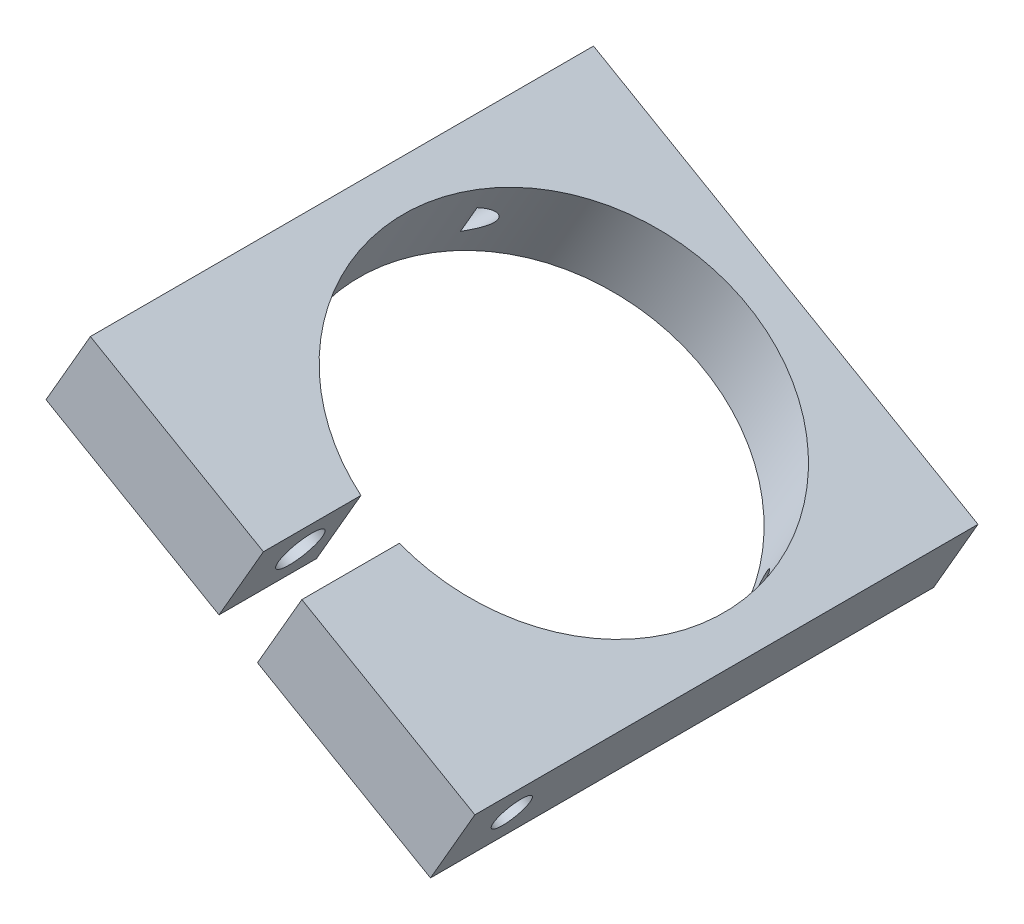
ISO-10303-21;
HEADER;
FILE_DESCRIPTION(('STEP AP214'),'2;1');
FILE_NAME('part.step','',(''),(''),'','','');
FILE_SCHEMA(('AUTOMOTIVE_DESIGN { 1 0 10303 214 1 1 1 1 }'));
ENDSEC;
DATA;
#1=APPLICATION_CONTEXT('core data for automotive mechanical design processes');
#2=APPLICATION_PROTOCOL_DEFINITION('international standard','automotive_design',2000,#1);
#3=PRODUCT_CONTEXT('',#1,'mechanical');
#4=PRODUCT('Part','Part','',(#3));
#5=PRODUCT_RELATED_PRODUCT_CATEGORY('part','',(#4));
#6=PRODUCT_DEFINITION_FORMATION('','',#4);
#7=PRODUCT_DEFINITION_CONTEXT('part definition',#1,'design');
#8=PRODUCT_DEFINITION('design','',#6,#7);
#9=PRODUCT_DEFINITION_SHAPE('','',#8);
#10=(LENGTH_UNIT() NAMED_UNIT(*) SI_UNIT(.MILLI.,.METRE.));
#11=(NAMED_UNIT(*) PLANE_ANGLE_UNIT() SI_UNIT($,.RADIAN.));
#12=(NAMED_UNIT(*) SI_UNIT($,.STERADIAN.) SOLID_ANGLE_UNIT());
#13=UNCERTAINTY_MEASURE_WITH_UNIT(LENGTH_MEASURE(1.E-05),#10,'distance_accuracy_value','');
#14=(GEOMETRIC_REPRESENTATION_CONTEXT(3) GLOBAL_UNCERTAINTY_ASSIGNED_CONTEXT((#13)) GLOBAL_UNIT_ASSIGNED_CONTEXT((#10,
#11,#12)) REPRESENTATION_CONTEXT('',''));
#15=CARTESIAN_POINT('',(0.,0.,0.));
#16=DIRECTION('',(0.,0.,1.));
#17=DIRECTION('',(1.,0.,0.));
#18=AXIS2_PLACEMENT_3D('',#15,#16,#17);
#19=CARTESIAN_POINT('',(127.607695154588,912.355023730723,-391.357743681072));
#20=DIRECTION('',(0.,0.,1.));
#21=DIRECTION('',(1.,0.,0.));
#22=AXIS2_PLACEMENT_3D('',#19,#20,#21);
#23=PLANE('',#22);
#24=DIRECTION('',(0.5,0.866025403784439,0.));
#25=VECTOR('',#24,1.);
#26=CARTESIAN_POINT('',(128.078432583509,912.083243349418,-391.357743681072));
#27=LINE('',#26,#25);
#28=CARTESIAN_POINT('',(128.641247317091,913.058067063231,-391.357743681072));
#29=VERTEX_POINT('',#28);
#30=CARTESIAN_POINT('',(127.515617849926,911.108419635604,-391.357743681072));
#31=VERTEX_POINT('',#30);
#32=EDGE_CURVE('E91',#29,#31,#27,.F.);
#33=ORIENTED_EDGE('',*,*,#32,.T.);
#34=CARTESIAN_POINT('',(127.607695154588,912.355023730723,-391.357743681072));
#35=DIRECTION('',(0.,0.,1.));
#36=DIRECTION('',(1.,0.,0.));
#37=AXIS2_PLACEMENT_3D('',#34,#35,#36);
#38=CIRCLE('',#37,1.25);
#39=EDGE_CURVE('E20',#31,#29,#38,.F.);
#40=ORIENTED_EDGE('',*,*,#39,.T.);
#41=EDGE_LOOP('',(#33,#40));
#42=FACE_BOUND('',#41,.T.);
#43=ADVANCED_FACE('F17',(#42),#23,.F.);
#44=CARTESIAN_POINT('',(147.923440835426,899.577290072852,-391.357743681072));
#45=DIRECTION('',(0.,0.,1.));
#46=DIRECTION('',(1.,0.,0.));
#47=AXIS2_PLACEMENT_3D('',#44,#45,#46);
#48=PLANE('',#47);
#49=CARTESIAN_POINT('',(147.923440835426,899.577290072852,-391.357743681072));
#50=DIRECTION('',(0.,0.,1.));
#51=DIRECTION('',(1.,0.,0.));
#52=AXIS2_PLACEMENT_3D('',#49,#50,#51);
#53=CIRCLE('',#52,1.25);
#54=CARTESIAN_POINT('',(148.034465714591,900.822349700422,-391.357743681072));
#55=VERTEX_POINT('',#54);
#56=CARTESIAN_POINT('',(146.900700008306,898.858609893257,-391.357743681072));
#57=VERTEX_POINT('',#56);
#58=EDGE_CURVE('E100',#55,#57,#53,.F.);
#59=ORIENTED_EDGE('',*,*,#58,.T.);
#60=DIRECTION('',(0.5,0.866025403784439,0.));
#61=VECTOR('',#60,1.);
#62=CARTESIAN_POINT('',(147.921567416493,900.626804112028,-391.357743681072));
#63=LINE('',#62,#61);
#64=EDGE_CURVE('E103',#57,#55,#63,.T.);
#65=ORIENTED_EDGE('',*,*,#64,.T.);
#66=EDGE_LOOP('',(#59,#65));
#67=FACE_BOUND('',#66,.T.);
#68=ADVANCED_FACE('F317',(#67),#48,.F.);
#69=CARTESIAN_POINT('',(130.85529041878,910.480023730723,-371.357743681072));
#70=DIRECTION('',(0.866025403784439,-0.5,0.));
#71=DIRECTION('',(0.5,0.866025403784439,0.));
#72=AXIS2_PLACEMENT_3D('',#69,#70,#71);
#73=CYLINDRICAL_SURFACE('',#72,1.5);
#74=CARTESIAN_POINT('',(136.700961894325,907.105023730723,-371.357743681072));
#75=DIRECTION('',(0.866025403784439,-0.5,0.));
#76=DIRECTION('',(0.5,0.866025403784439,0.));
#77=AXIS2_PLACEMENT_3D('',#74,#75,#76);
#78=CIRCLE('',#77,1.5);
#79=CARTESIAN_POINT('',(137.450961894325,908.4040618364,-371.357743681072));
#80=VERTEX_POINT('',#79);
#81=EDGE_CURVE('E144',#80,#80,#78,.F.);
#82=ORIENTED_EDGE('',*,*,#81,.F.);
#83=EDGE_LOOP('',(#82));
#84=FACE_BOUND('',#83,.T.);
#85=CARTESIAN_POINT('',(125.009618943235,913.855023730723,-371.357743681072));
#86=DIRECTION('',(0.866025403784439,-0.5,0.));
#87=DIRECTION('',(0.5,0.866025403784439,0.));
#88=AXIS2_PLACEMENT_3D('',#85,#86,#87);
#89=CIRCLE('',#88,1.5);
#90=CARTESIAN_POINT('',(125.759618943235,915.1540618364,-371.357743681072));
#91=VERTEX_POINT('',#90);
#92=EDGE_CURVE('E166',#91,#91,#89,.F.);
#93=ORIENTED_EDGE('',*,*,#92,.T.);
#94=EDGE_LOOP('',(#93));
#95=FACE_BOUND('',#94,.T.);
#96=ADVANCED_FACE('F314',(#84,#95),#73,.F.);
#97=CARTESIAN_POINT('',(127.607695154588,912.355023730723,-396.357743681072));
#98=DIRECTION('',(0.,0.,1.));
#99=DIRECTION('',(1.,0.,0.));
#100=AXIS2_PLACEMENT_3D('',#97,#98,#99);
#101=CYLINDRICAL_SURFACE('',#100,1.25);
#102=ORIENTED_EDGE('',*,*,#39,.F.);
#103=CARTESIAN_POINT('',(127.515617849926,911.108419635604,-391.357743681072));
#104=CARTESIAN_POINT('',(127.54807471522,911.106050589834,-391.424874986713));
#105=CARTESIAN_POINT('',(127.581753510776,911.104811756495,-391.491501734669));
#106=CARTESIAN_POINT('',(127.651813067832,911.105301750291,-391.623599616107));
#107=CARTESIAN_POINT('',(127.688202877727,911.107040984337,-391.689065886078));
#108=CARTESIAN_POINT('',(127.764115266057,911.114258744202,-391.81890168151));
#109=CARTESIAN_POINT('',(127.803666827872,911.119776499278,-391.883252367619));
#110=CARTESIAN_POINT('',(127.885614062564,911.135596297288,-392.009411103044));
#111=CARTESIAN_POINT('',(127.928005245685,911.145890933397,-392.07122292807));
#112=CARTESIAN_POINT('',(128.010968981248,911.171156167609,-392.184933084611));
#113=CARTESIAN_POINT('',(128.05124462519,911.185502748532,-392.237181628786));
#114=CARTESIAN_POINT('',(128.13400057092,911.220335195923,-392.337858019734));
#115=CARTESIAN_POINT('',(128.176481354416,911.240822408507,-392.386285025827));
#116=CARTESIAN_POINT('',(128.263855277881,911.289888593677,-392.478254782908));
#117=CARTESIAN_POINT('',(128.30877587796,911.31858995285,-392.521708573745));
#118=CARTESIAN_POINT('',(128.399051897722,911.385807805282,-392.599688219838));
#119=CARTESIAN_POINT('',(128.444404325545,911.424278053507,-392.634254636942));
#120=CARTESIAN_POINT('',(128.51382936587,911.493228533298,-392.678169033972));
#121=CARTESIAN_POINT('',(128.538697014567,911.520074413817,-392.691977271443));
#122=CARTESIAN_POINT('',(128.586854888245,911.577123786808,-392.714349171645));
#123=CARTESIAN_POINT('',(128.610148842541,911.607318858673,-392.722925650125));
#124=CARTESIAN_POINT('',(128.642454599526,911.653528474459,-392.731151203177));
#125=CARTESIAN_POINT('',(128.652438825391,911.668484945408,-392.733121607686));
#126=CARTESIAN_POINT('',(128.671803701858,911.69890011528,-392.735756622392));
#127=CARTESIAN_POINT('',(128.681184218165,911.714358924804,-392.73642094302));
#128=CARTESIAN_POINT('',(128.709184715066,911.762864656355,-392.73641521187));
#129=CARTESIAN_POINT('',(128.726657704516,911.796610981722,-392.733483360501));
#130=CARTESIAN_POINT('',(128.758161244347,911.864773677753,-392.722004282596));
#131=CARTESIAN_POINT('',(128.772185602231,911.899191135681,-392.713447054638));
#132=CARTESIAN_POINT('',(128.796633060627,911.967425812386,-392.691472107619));
#133=CARTESIAN_POINT('',(128.807080454743,912.001245538302,-392.678088497932));
#134=CARTESIAN_POINT('',(128.824744354126,912.067830543306,-392.64728285928));
#135=CARTESIAN_POINT('',(128.831960535929,912.100595716522,-392.629860426269));
#136=CARTESIAN_POINT('',(128.847393961868,912.185955414199,-392.579118213455));
#137=CARTESIAN_POINT('',(128.853100921507,912.237288788129,-392.542918519008));
#138=CARTESIAN_POINT('',(128.858511559909,912.335372551267,-392.464363314685));
#139=CARTESIAN_POINT('',(128.858196807211,912.3821084294,-392.421989299126));
#140=CARTESIAN_POINT('',(128.853452887133,912.46479446094,-392.339275940134));
#141=CARTESIAN_POINT('',(128.84960665655,912.501338180819,-392.299484027972));
#142=CARTESIAN_POINT('',(128.839346546395,912.571320102624,-392.217547113975));
#143=CARTESIAN_POINT('',(128.83293063112,912.604755816452,-392.175400269395));
#144=CARTESIAN_POINT('',(128.810684890219,912.700973792304,-392.046047910079));
#145=CARTESIAN_POINT('',(128.791876600757,912.759453640975,-391.956153765721));
#146=CARTESIAN_POINT('',(128.751847796501,912.86103509998,-391.782004780797));
#147=CARTESIAN_POINT('',(128.731106627847,912.905115215574,-391.698188242048));
#148=CARTESIAN_POINT('',(128.698356557038,912.966154015777,-391.571117453221));
#149=CARTESIAN_POINT('',(128.687236855241,912.985553982897,-391.528788775997));
#150=CARTESIAN_POINT('',(128.664549041072,913.022882440661,-391.443628570795));
#151=CARTESIAN_POINT('',(128.652981128489,913.040811576061,-391.400797272661));
#152=CARTESIAN_POINT('',(128.641247317092,913.058067063231,-391.357743681072));
#153=B_SPLINE_CURVE_WITH_KNOTS('',3,(#103,#104,#105,#106,#107,#108,#109,#110,#111,#112,#113,
#114,#115,#116,#117,#118,#119,#120,#121,#122,#123,#124,#125,#126,#127,#128,#129,#130,#131,#132,
#133,#134,#135,#136,#137,#138,#139,#140,#141,#142,#143,#144,#145,#146,#147,#148,#149,#150,#151,
#152),.UNSPECIFIED.,.F.,.F.,(4,2,2,2,2,2,2,2,2,2,2,2,2,2,2,2,2,2,2,2,2,2,2,2,4),(0.,
0.223852835244016,0.448489525676511,0.675494513857129,0.902148688066406,1.10435915089795,
1.30661397366406,1.51205494754366,1.71654094560003,1.83345002557257,1.95007156215788,
2.00428725628244,2.05851496910174,2.17220219210489,2.28609208955794,2.3991923820805,
2.51230399409453,2.70043472715132,2.889141389009,3.05139545995606,3.21377832364974,
3.53946222025231,3.8300001333799,3.97359127374229,4.11711912909585),.UNSPECIFIED.);
#154=EDGE_CURVE('E98',#31,#29,#153,.T.);
#155=ORIENTED_EDGE('',*,*,#154,.T.);
#156=EDGE_LOOP('',(#102,#155));
#157=FACE_BOUND('',#156,.T.);
#158=CARTESIAN_POINT('',(127.607695154588,912.355023730723,-401.357743681072));
#159=DIRECTION('',(0.,0.,1.));
#160=DIRECTION('',(1.,0.,0.));
#161=AXIS2_PLACEMENT_3D('',#158,#159,#160);
#162=CIRCLE('',#161,1.25);
#163=CARTESIAN_POINT('',(128.857695154588,912.355023730723,-401.357743681072));
#164=VERTEX_POINT('',#163);
#165=EDGE_CURVE('E131',#164,#164,#162,.F.);
#166=ORIENTED_EDGE('',*,*,#165,.T.);
#167=EDGE_LOOP('',(#166));
#168=FACE_BOUND('',#167,.T.);
#169=ADVANCED_FACE('F96',(#157,#168),#101,.F.);
#170=CARTESIAN_POINT('',(147.923440835426,899.577290072852,-396.357743681072));
#171=DIRECTION('',(0.,0.,1.));
#172=DIRECTION('',(1.,0.,0.));
#173=AXIS2_PLACEMENT_3D('',#170,#171,#172);
#174=CYLINDRICAL_SURFACE('',#173,1.25);
#175=ORIENTED_EDGE('',*,*,#58,.F.);
#176=CARTESIAN_POINT('',(148.034465714591,900.822349700422,-391.357743681072));
#177=CARTESIAN_POINT('',(148.001685335158,900.82524384968,-391.426118824964));
#178=CARTESIAN_POINT('',(147.967649258731,900.827000381739,-391.493987142952));
#179=CARTESIAN_POINT('',(147.896799470938,900.827518074483,-391.628565866878));
#180=CARTESIAN_POINT('',(147.859976451299,900.826268725714,-391.69527138649));
#181=CARTESIAN_POINT('',(147.783116358518,900.819991611245,-391.827580703307));
#182=CARTESIAN_POINT('',(147.743049836009,900.814924675961,-391.89316582164));
#183=CARTESIAN_POINT('',(147.659982687579,900.799939584957,-392.021779187282));
#184=CARTESIAN_POINT('',(147.61698669578,900.79002894489,-392.084811232478));
#185=CARTESIAN_POINT('',(147.532952989021,900.765446584561,-392.200578846786));
#186=CARTESIAN_POINT('',(147.49223234493,900.751429741596,-392.253678407756));
#187=CARTESIAN_POINT('',(147.408518552955,900.717202382865,-392.356068406961));
#188=CARTESIAN_POINT('',(147.36552482198,900.69699027145,-392.405357859767));
#189=CARTESIAN_POINT('',(147.277046241013,900.648397228245,-392.499070386439));
#190=CARTESIAN_POINT('',(147.231532954771,900.619893533898,-392.543405339136));
#191=CARTESIAN_POINT('',(147.139984278573,900.552928445523,-392.623148278189));
#192=CARTESIAN_POINT('',(147.093952309647,900.514514069881,-392.658596898558));
#193=CARTESIAN_POINT('',(147.023519411676,900.445576908907,-392.70377457134));
#194=CARTESIAN_POINT('',(146.998345402925,900.418787279048,-392.718004066658));
#195=CARTESIAN_POINT('',(146.94954420597,900.361778475027,-392.741225264732));
#196=CARTESIAN_POINT('',(146.925913469435,900.331567638598,-392.750229387233));
#197=CARTESIAN_POINT('',(146.89241757189,900.284299293164,-392.759248121986));
#198=CARTESIAN_POINT('',(146.881623287104,900.268297105439,-392.761506200025));
#199=CARTESIAN_POINT('',(146.860725552224,900.235705717238,-392.764526474794));
#200=CARTESIAN_POINT('',(146.850622256625,900.219116386736,-392.765288338038));
#201=CARTESIAN_POINT('',(146.821872232837,900.169312190052,-392.765282456633));
#202=CARTESIAN_POINT('',(146.804333914886,900.135424005329,-392.762344456206));
#203=CARTESIAN_POINT('',(146.772726650654,900.066969182398,-392.750840965679));
#204=CARTESIAN_POINT('',(146.758663587022,900.032401499296,-392.742266022355));
#205=CARTESIAN_POINT('',(146.734163565083,899.963859921335,-392.72024282091));
#206=CARTESIAN_POINT('',(146.723702348838,899.92988357828,-392.706828462187));
#207=CARTESIAN_POINT('',(146.706034367449,899.862983548184,-392.675948220419));
#208=CARTESIAN_POINT('',(146.698828013284,899.830059994562,-392.65848182616));
#209=CARTESIAN_POINT('',(146.683463923184,899.744361690732,-392.607653095012));
#210=CARTESIAN_POINT('',(146.677824058121,899.692845120789,-392.571413403411));
#211=CARTESIAN_POINT('',(146.672580271348,899.594403649249,-392.492766690766));
#212=CARTESIAN_POINT('',(146.672994662646,899.547493111017,-392.450341342548));
#213=CARTESIAN_POINT('',(146.67794382546,899.464576325572,-392.367601976533));
#214=CARTESIAN_POINT('',(146.681885187597,899.42796755008,-392.327843519814));
#215=CARTESIAN_POINT('',(146.692342451637,899.357855171758,-392.245973863277));
#216=CARTESIAN_POINT('',(146.698860381163,899.32435404018,-392.203860832995));
#217=CARTESIAN_POINT('',(146.721425926847,899.227933868228,-392.074595294413));
#218=CARTESIAN_POINT('',(146.740464148732,899.169323487853,-391.98475164175));
#219=CARTESIAN_POINT('',(146.782016964543,899.064835340716,-391.806105751061));
#220=CARTESIAN_POINT('',(146.804264955735,899.018415280526,-391.717546878827));
#221=CARTESIAN_POINT('',(146.839415646757,898.954418743631,-391.583249074795));
#222=CARTESIAN_POINT('',(146.851349367753,898.93413456128,-391.538522521981));
#223=CARTESIAN_POINT('',(146.875697452854,898.895190812749,-391.448525373925));
#224=CARTESIAN_POINT('',(146.888111558155,898.87653038891,-391.403255080442));
#225=CARTESIAN_POINT('',(146.900700008306,898.858609893257,-391.357743681072));
#226=B_SPLINE_CURVE_WITH_KNOTS('',3,(#176,#177,#178,#179,#180,#181,#182,#183,#184,#185,#186,
#187,#188,#189,#190,#191,#192,#193,#194,#195,#196,#197,#198,#199,#200,#201,#202,#203,#204,#205,
#206,#207,#208,#209,#210,#211,#212,#213,#214,#215,#216,#217,#218,#219,#220,#221,#222,#223,#224,
#225),.UNSPECIFIED.,.F.,.F.,(4,2,2,2,2,2,2,2,2,2,2,2,2,2,2,2,2,2,2,2,2,2,2,2,4),(0.,
0.22768946313699,0.456176152549731,0.687039662433701,0.917546088669269,1.12232442490655,
1.32715554809245,1.53518877012598,1.74225262794169,1.86008396629252,1.97763408205672,
2.03586724255426,2.09411338088815,2.20826995355054,2.3226184582809,2.43618104480916,
2.54975796643966,2.73838441851071,2.92758154860634,3.08991448972487,3.25237543350151,
3.57826663381483,3.88520294132719,4.03679663083218,4.18830975723314),.UNSPECIFIED.);
#227=EDGE_CURVE('E150',#55,#57,#226,.T.);
#228=ORIENTED_EDGE('',*,*,#227,.T.);
#229=EDGE_LOOP('',(#175,#228));
#230=FACE_BOUND('',#229,.T.);
#231=CARTESIAN_POINT('',(147.923440835426,899.577290072852,-401.357743681072));
#232=DIRECTION('',(0.,0.,1.));
#233=DIRECTION('',(1.,0.,0.));
#234=AXIS2_PLACEMENT_3D('',#231,#232,#233);
#235=CIRCLE('',#234,1.25);
#236=CARTESIAN_POINT('',(149.173440835426,899.577290072852,-401.357743681072));
#237=VERTEX_POINT('',#236);
#238=EDGE_CURVE('E161',#237,#237,#235,.F.);
#239=ORIENTED_EDGE('',*,*,#238,.T.);
#240=EDGE_LOOP('',(#239));
#241=FACE_BOUND('',#240,.T.);
#242=ADVANCED_FACE('F183',(#230,#241),#174,.F.);
#243=CARTESIAN_POINT('',(149.490381056768,896.25694751937,-367.357743681072));
#244=DIRECTION('',(-0.500000000000002,-0.866025403784438,0.));
#245=DIRECTION('',(0.866025403784438,-0.500000000000002,0.));
#246=AXIS2_PLACEMENT_3D('',#243,#244,#245);
#247=PLANE('',#246);
#248=DIRECTION('',(0.,0.,1.));
#249=VECTOR('',#248,1.);
#250=CARTESIAN_POINT('',(149.490381056768,896.25694751937,-367.357743681072));
#251=LINE('',#250,#249);
#252=CARTESIAN_POINT('',(149.490381056768,896.25694751937,-401.357743681072));
#253=VERTEX_POINT('',#252);
#254=CARTESIAN_POINT('',(149.490381056768,896.25694751937,-367.357743681072));
#255=VERTEX_POINT('',#254);
#256=EDGE_CURVE('E123',#253,#255,#251,.T.);
#257=ORIENTED_EDGE('',*,*,#256,.T.);
#258=DIRECTION('',(-0.866025403784439,0.499999999999999,0.));
#259=VECTOR('',#258,1.);
#260=CARTESIAN_POINT('',(149.490381056768,896.25694751937,-367.357743681072));
#261=LINE('',#260,#259);
#262=CARTESIAN_POINT('',(137.799038105678,903.00694751937,-367.357743681072));
#263=VERTEX_POINT('',#262);
#264=EDGE_CURVE('E118',#255,#263,#261,.T.);
#265=ORIENTED_EDGE('',*,*,#264,.T.);
#266=DIRECTION('',(0.,0.,1.));
#267=VECTOR('',#266,1.);
#268=CARTESIAN_POINT('',(137.799038105678,903.00694751937,-369.857743681072));
#269=LINE('',#268,#267);
#270=CARTESIAN_POINT('',(137.799038105678,903.00694751937,-373.948070035081));
#271=VERTEX_POINT('',#270);
#272=EDGE_CURVE('E112',#271,#263,#269,.T.);
#273=ORIENTED_EDGE('',*,*,#272,.F.);
#274=CARTESIAN_POINT('',(136.500000000001,903.75694751937,-386.357743681072));
#275=DIRECTION('',(0.5,0.866025403784439,0.));
#276=DIRECTION('',(-0.866025403784439,0.5,0.));
#277=AXIS2_PLACEMENT_3D('',#274,#275,#276);
#278=CIRCLE('',#277,12.5);
#279=CARTESIAN_POINT('',(135.200961894325,904.50694751937,-373.948070035081));
#280=VERTEX_POINT('',#279);
#281=EDGE_CURVE('E105',#271,#280,#278,.T.);
#282=ORIENTED_EDGE('',*,*,#281,.T.);
#283=DIRECTION('',(0.,0.,1.));
#284=VECTOR('',#283,1.);
#285=CARTESIAN_POINT('',(135.200961894325,904.50694751937,-369.857743681072));
#286=LINE('',#285,#284);
#287=CARTESIAN_POINT('',(135.200961894325,904.50694751937,-367.357743681072));
#288=VERTEX_POINT('',#287);
#289=EDGE_CURVE('E147',#288,#280,#286,.F.);
#290=ORIENTED_EDGE('',*,*,#289,.F.);
#291=DIRECTION('',(-0.866025403784438,0.5,0.));
#292=VECTOR('',#291,1.);
#293=CARTESIAN_POINT('',(135.200961894325,904.50694751937,-367.357743681072));
#294=LINE('',#293,#292);
#295=CARTESIAN_POINT('',(123.509618943235,911.25694751937,-367.357743681072));
#296=VERTEX_POINT('',#295);
#297=EDGE_CURVE('E141',#288,#296,#294,.T.);
#298=ORIENTED_EDGE('',*,*,#297,.T.);
#299=DIRECTION('',(0.,0.,1.));
#300=VECTOR('',#299,1.);
#301=CARTESIAN_POINT('',(123.509618943235,911.25694751937,-367.357743681072));
#302=LINE('',#301,#300);
#303=CARTESIAN_POINT('',(123.509618943235,911.25694751937,-401.357743681072));
#304=VERTEX_POINT('',#303);
#305=EDGE_CURVE('E135',#296,#304,#302,.F.);
#306=ORIENTED_EDGE('',*,*,#305,.T.);
#307=DIRECTION('',(0.866025403784437,-0.500000000000003,0.));
#308=VECTOR('',#307,1.);
#309=CARTESIAN_POINT('',(123.509618943235,911.25694751937,-401.357743681072));
#310=LINE('',#309,#308);
#311=EDGE_CURVE('E129',#304,#253,#310,.T.);
#312=ORIENTED_EDGE('',*,*,#311,.T.);
#313=EDGE_LOOP('',(#257,#265,#273,#282,#290,#298,#306,#312));
#314=FACE_BOUND('',#313,.T.);
#315=ADVANCED_FACE('F196',(#314),#247,.T.);
#316=CARTESIAN_POINT('',(138.000000000001,906.355023730723,-371.357743681072));
#317=DIRECTION('',(-0.866025403784439,0.5,0.));
#318=DIRECTION('',(-0.5,-0.866025403784439,0.));
#319=AXIS2_PLACEMENT_3D('',#316,#317,#318);
#320=CYLINDRICAL_SURFACE('',#319,1.25);
#321=CARTESIAN_POINT('',(139.299038105678,905.605023730723,-371.357743681072));
#322=DIRECTION('',(-0.866025403784439,0.5,0.));
#323=DIRECTION('',(-0.5,-0.866025403784439,0.));
#324=AXIS2_PLACEMENT_3D('',#321,#322,#323);
#325=CIRCLE('',#324,1.25);
#326=CARTESIAN_POINT('',(138.674038105678,904.522491975992,-371.357743681072));
#327=VERTEX_POINT('',#326);
#328=EDGE_CURVE('E114',#327,#327,#325,.F.);
#329=ORIENTED_EDGE('',*,*,#328,.F.);
#330=EDGE_LOOP('',(#329));
#331=FACE_BOUND('',#330,.T.);
#332=CARTESIAN_POINT('',(150.990381056768,898.855023730723,-371.357743681072));
#333=DIRECTION('',(-0.866025403784439,0.5,0.));
#334=DIRECTION('',(-0.5,-0.866025403784439,0.));
#335=AXIS2_PLACEMENT_3D('',#332,#333,#334);
#336=CIRCLE('',#335,1.25);
#337=CARTESIAN_POINT('',(150.365381056768,897.772491975992,-371.357743681072));
#338=VERTEX_POINT('',#337);
#339=EDGE_CURVE('E125',#338,#338,#336,.F.);
#340=ORIENTED_EDGE('',*,*,#339,.T.);
#341=EDGE_LOOP('',(#340));
#342=FACE_BOUND('',#341,.T.);
#343=ADVANCED_FACE('F191',(#331,#342),#320,.F.);
#344=CARTESIAN_POINT('',(138.000000000001,906.355023730723,-386.357743681072));
#345=DIRECTION('',(0.5,0.866025403784439,0.));
#346=DIRECTION('',(-0.866025403784439,0.5,0.));
#347=AXIS2_PLACEMENT_3D('',#344,#345,#346);
#348=CYLINDRICAL_SURFACE('',#347,12.5);
#349=ORIENTED_EDGE('',*,*,#227,.F.);
#350=ORIENTED_EDGE('',*,*,#64,.F.);
#351=EDGE_LOOP('',(#349,#350));
#352=FACE_BOUND('',#351,.T.);
#353=ORIENTED_EDGE('',*,*,#154,.F.);
#354=ORIENTED_EDGE('',*,*,#32,.F.);
#355=EDGE_LOOP('',(#353,#354));
#356=FACE_BOUND('',#355,.T.);
#357=CARTESIAN_POINT('',(139.500000000001,908.953099942076,-386.357743681072));
#358=DIRECTION('',(0.5,0.866025403784439,0.));
#359=DIRECTION('',(-0.866025403784439,0.5,0.));
#360=AXIS2_PLACEMENT_3D('',#357,#358,#359);
#361=CIRCLE('',#360,12.5);
#362=CARTESIAN_POINT('',(140.799038105678,908.203099942077,-373.948070035081));
#363=VERTEX_POINT('',#362);
#364=CARTESIAN_POINT('',(138.200961894325,909.703099942076,-373.948070035081));
#365=VERTEX_POINT('',#364);
#366=EDGE_CURVE('E153',#363,#365,#361,.T.);
#367=ORIENTED_EDGE('',*,*,#366,.T.);
#368=DIRECTION('',(0.5,0.866025403784439,0.));
#369=VECTOR('',#368,1.);
#370=CARTESIAN_POINT('',(136.700961894325,907.105023730723,-373.948070035081));
#371=LINE('',#370,#369);
#372=EDGE_CURVE('E149',#280,#365,#371,.T.);
#373=ORIENTED_EDGE('',*,*,#372,.F.);
#374=ORIENTED_EDGE('',*,*,#281,.F.);
#375=DIRECTION('',(-0.5,-0.866025403784439,0.));
#376=VECTOR('',#375,1.);
#377=CARTESIAN_POINT('',(139.299038105678,905.605023730723,-373.948070035081));
#378=LINE('',#377,#376);
#379=EDGE_CURVE('E115',#363,#271,#378,.T.);
#380=ORIENTED_EDGE('',*,*,#379,.F.);
#381=EDGE_LOOP('',(#367,#373,#374,#380));
#382=FACE_BOUND('',#381,.T.);
#383=ADVANCED_FACE('F101',(#352,#356,#382),#348,.F.);
#384=CARTESIAN_POINT('',(136.700961894325,907.105023730723,-369.857743681072));
#385=DIRECTION('',(0.866025403784439,-0.5,0.));
#386=DIRECTION('',(0.5,0.866025403784439,0.));
#387=AXIS2_PLACEMENT_3D('',#384,#385,#386);
#388=PLANE('',#387);
#389=ORIENTED_EDGE('',*,*,#81,.T.);
#390=EDGE_LOOP('',(#389));
#391=FACE_BOUND('',#390,.T.);
#392=ORIENTED_EDGE('',*,*,#372,.T.);
#393=DIRECTION('',(0.,0.,1.));
#394=VECTOR('',#393,1.);
#395=CARTESIAN_POINT('',(138.200961894325,909.703099942077,-367.357743681072));
#396=LINE('',#395,#394);
#397=CARTESIAN_POINT('',(138.200961894325,909.703099942077,-367.357743681072));
#398=VERTEX_POINT('',#397);
#399=EDGE_CURVE('E156',#365,#398,#396,.T.);
#400=ORIENTED_EDGE('',*,*,#399,.T.);
#401=DIRECTION('',(-0.500000000000039,-0.866025403784416,0.));
#402=VECTOR('',#401,1.);
#403=CARTESIAN_POINT('',(138.200961894325,909.703099942076,-367.357743681072));
#404=LINE('',#403,#402);
#405=EDGE_CURVE('E138',#398,#288,#404,.T.);
#406=ORIENTED_EDGE('',*,*,#405,.T.);
#407=ORIENTED_EDGE('',*,*,#289,.T.);
#408=EDGE_LOOP('',(#392,#400,#406,#407));
#409=FACE_BOUND('',#408,.T.);
#410=ADVANCED_FACE('F190',(#391,#409),#388,.T.);
#411=CARTESIAN_POINT('',(118.336783205462,907.493485625047,-367.357743681072));
#412=DIRECTION('',(0.,0.,-1.));
#413=DIRECTION('',(-1.,0.,0.));
#414=AXIS2_PLACEMENT_3D('',#411,#412,#413);
#415=PLANE('',#414);
#416=DIRECTION('',(0.866025403784439,-0.499999999999999,0.));
#417=VECTOR('',#416,1.);
#418=CARTESIAN_POINT('',(152.490381056768,901.453099942077,-367.357743681072));
#419=LINE('',#418,#417);
#420=CARTESIAN_POINT('',(126.509618943235,916.453099942077,-367.357743681072));
#421=VERTEX_POINT('',#420);
#422=EDGE_CURVE('E242',#398,#421,#419,.F.);
#423=ORIENTED_EDGE('',*,*,#422,.T.);
#424=DIRECTION('',(0.499999999999996,0.866025403784441,0.));
#425=VECTOR('',#424,1.);
#426=CARTESIAN_POINT('',(126.509618943235,916.453099942077,-367.357743681072));
#427=LINE('',#426,#425);
#428=EDGE_CURVE('E137',#421,#296,#427,.F.);
#429=ORIENTED_EDGE('',*,*,#428,.T.);
#430=ORIENTED_EDGE('',*,*,#297,.F.);
#431=ORIENTED_EDGE('',*,*,#405,.F.);
#432=EDGE_LOOP('',(#423,#429,#430,#431));
#433=FACE_BOUND('',#432,.T.);
#434=ADVANCED_FACE('F231',(#433),#415,.F.);
#435=CARTESIAN_POINT('',(126.509618943235,916.453099942077,-367.357743681072));
#436=DIRECTION('',(0.866025403784441,-0.499999999999996,0.));
#437=DIRECTION('',(0.499999999999996,0.866025403784441,0.));
#438=AXIS2_PLACEMENT_3D('',#435,#436,#437);
#439=PLANE('',#438);
#440=ORIENTED_EDGE('',*,*,#92,.F.);
#441=EDGE_LOOP('',(#440));
#442=FACE_BOUND('',#441,.T.);
#443=DIRECTION('',(0.,0.,1.));
#444=VECTOR('',#443,1.);
#445=CARTESIAN_POINT('',(126.509618943235,916.453099942077,-367.357743681072));
#446=LINE('',#445,#444);
#447=CARTESIAN_POINT('',(126.509618943235,916.453099942077,-401.357743681072));
#448=VERTEX_POINT('',#447);
#449=EDGE_CURVE('E247',#421,#448,#446,.F.);
#450=ORIENTED_EDGE('',*,*,#449,.T.);
#451=DIRECTION('',(-0.499999999999975,-0.866025403784453,0.));
#452=VECTOR('',#451,1.);
#453=CARTESIAN_POINT('',(126.509618943235,916.453099942077,-401.357743681072));
#454=LINE('',#453,#452);
#455=EDGE_CURVE('E132',#448,#304,#454,.T.);
#456=ORIENTED_EDGE('',*,*,#455,.T.);
#457=ORIENTED_EDGE('',*,*,#305,.F.);
#458=ORIENTED_EDGE('',*,*,#428,.F.);
#459=EDGE_LOOP('',(#450,#456,#457,#458));
#460=FACE_BOUND('',#459,.T.);
#461=ADVANCED_FACE('F228',(#442,#460),#439,.F.);
#462=CARTESIAN_POINT('',(130.754809471618,929.002138047753,-401.357743681072));
#463=DIRECTION('',(0.,0.,1.));
#464=DIRECTION('',(1.,0.,0.));
#465=AXIS2_PLACEMENT_3D('',#462,#463,#464);
#466=PLANE('',#465);
#467=ORIENTED_EDGE('',*,*,#238,.F.);
#468=EDGE_LOOP('',(#467));
#469=FACE_BOUND('',#468,.T.);
#470=ORIENTED_EDGE('',*,*,#165,.F.);
#471=EDGE_LOOP('',(#470));
#472=FACE_BOUND('',#471,.T.);
#473=ORIENTED_EDGE('',*,*,#311,.F.);
#474=ORIENTED_EDGE('',*,*,#455,.F.);
#475=DIRECTION('',(0.866025403784439,-0.499999999999999,0.));
#476=VECTOR('',#475,1.);
#477=CARTESIAN_POINT('',(152.490381056768,901.453099942077,-401.357743681072));
#478=LINE('',#477,#476);
#479=CARTESIAN_POINT('',(152.490381056768,901.453099942077,-401.357743681072));
#480=VERTEX_POINT('',#479);
#481=EDGE_CURVE('E250',#448,#480,#478,.T.);
#482=ORIENTED_EDGE('',*,*,#481,.T.);
#483=DIRECTION('',(-0.499999999999998,-0.86602540378444,0.));
#484=VECTOR('',#483,1.);
#485=CARTESIAN_POINT('',(149.490381056768,896.25694751937,-401.357743681072));
#486=LINE('',#485,#484);
#487=EDGE_CURVE('E126',#480,#253,#486,.T.);
#488=ORIENTED_EDGE('',*,*,#487,.T.);
#489=EDGE_LOOP('',(#473,#474,#482,#488));
#490=FACE_BOUND('',#489,.T.);
#491=ADVANCED_FACE('F224',(#469,#472,#490),#466,.F.);
#492=CARTESIAN_POINT('',(149.490381056768,896.25694751937,-367.357743681072));
#493=DIRECTION('',(-0.86602540378444,0.499999999999998,0.));
#494=DIRECTION('',(-0.499999999999998,-0.86602540378444,0.));
#495=AXIS2_PLACEMENT_3D('',#492,#493,#494);
#496=PLANE('',#495);
#497=ORIENTED_EDGE('',*,*,#339,.F.);
#498=EDGE_LOOP('',(#497));
#499=FACE_BOUND('',#498,.T.);
#500=ORIENTED_EDGE('',*,*,#256,.F.);
#501=ORIENTED_EDGE('',*,*,#487,.F.);
#502=DIRECTION('',(0.,0.,1.));
#503=VECTOR('',#502,1.);
#504=CARTESIAN_POINT('',(152.490381056768,901.453099942077,-367.357743681072));
#505=LINE('',#504,#503);
#506=CARTESIAN_POINT('',(152.490381056768,901.453099942077,-367.357743681072));
#507=VERTEX_POINT('',#506);
#508=EDGE_CURVE('E273',#480,#507,#505,.T.);
#509=ORIENTED_EDGE('',*,*,#508,.T.);
#510=DIRECTION('',(-0.499999999999975,-0.866025403784453,0.));
#511=VECTOR('',#510,1.);
#512=CARTESIAN_POINT('',(152.490381056768,901.453099942077,-367.357743681072));
#513=LINE('',#512,#511);
#514=EDGE_CURVE('E120',#507,#255,#513,.T.);
#515=ORIENTED_EDGE('',*,*,#514,.T.);
#516=EDGE_LOOP('',(#500,#501,#509,#515));
#517=FACE_BOUND('',#516,.T.);
#518=ADVANCED_FACE('F220',(#499,#517),#496,.F.);
#519=CARTESIAN_POINT('',(132.626202367905,899.243485625046,-367.357743681072));
#520=DIRECTION('',(0.,0.,-1.));
#521=DIRECTION('',(-1.,0.,0.));
#522=AXIS2_PLACEMENT_3D('',#519,#520,#521);
#523=PLANE('',#522);
#524=ORIENTED_EDGE('',*,*,#264,.F.);
#525=ORIENTED_EDGE('',*,*,#514,.F.);
#526=DIRECTION('',(0.866025403784439,-0.499999999999999,0.));
#527=VECTOR('',#526,1.);
#528=CARTESIAN_POINT('',(152.490381056768,901.453099942077,-367.357743681072));
#529=LINE('',#528,#527);
#530=CARTESIAN_POINT('',(140.799038105678,908.203099942077,-367.357743681072));
#531=VERTEX_POINT('',#530);
#532=EDGE_CURVE('E26',#507,#531,#529,.F.);
#533=ORIENTED_EDGE('',*,*,#532,.T.);
#534=DIRECTION('',(-0.5,-0.866025403784439,0.));
#535=VECTOR('',#534,1.);
#536=CARTESIAN_POINT('',(139.299038105678,905.605023730723,-367.357743681072));
#537=LINE('',#536,#535);
#538=EDGE_CURVE('E34',#263,#531,#537,.F.);
#539=ORIENTED_EDGE('',*,*,#538,.F.);
#540=EDGE_LOOP('',(#524,#525,#533,#539));
#541=FACE_BOUND('',#540,.T.);
#542=ADVANCED_FACE('F213',(#541),#523,.F.);
#543=CARTESIAN_POINT('',(139.299038105678,905.605023730723,-369.857743681072));
#544=DIRECTION('',(-0.866025403784439,0.5,0.));
#545=DIRECTION('',(-0.5,-0.866025403784439,0.));
#546=AXIS2_PLACEMENT_3D('',#543,#544,#545);
#547=PLANE('',#546);
#548=ORIENTED_EDGE('',*,*,#328,.T.);
#549=EDGE_LOOP('',(#548));
#550=FACE_BOUND('',#549,.T.);
#551=ORIENTED_EDGE('',*,*,#379,.T.);
#552=ORIENTED_EDGE('',*,*,#272,.T.);
#553=ORIENTED_EDGE('',*,*,#538,.T.);
#554=DIRECTION('',(0.,0.,1.));
#555=VECTOR('',#554,1.);
#556=CARTESIAN_POINT('',(140.799038105678,908.203099942077,-367.357743681072));
#557=LINE('',#556,#555);
#558=EDGE_CURVE('E11',#531,#363,#557,.F.);
#559=ORIENTED_EDGE('',*,*,#558,.T.);
#560=EDGE_LOOP('',(#551,#552,#553,#559));
#561=FACE_BOUND('',#560,.T.);
#562=ADVANCED_FACE('F207',(#550,#561),#547,.T.);
#563=CARTESIAN_POINT('',(152.490381056768,901.453099942077,-367.357743681072));
#564=DIRECTION('',(-0.499999999999999,-0.866025403784439,0.));
#565=DIRECTION('',(0.866025403784439,-0.499999999999999,0.));
#566=AXIS2_PLACEMENT_3D('',#563,#564,#565);
#567=PLANE('',#566);
#568=ORIENTED_EDGE('',*,*,#532,.F.);
#569=ORIENTED_EDGE('',*,*,#508,.F.);
#570=ORIENTED_EDGE('',*,*,#481,.F.);
#571=ORIENTED_EDGE('',*,*,#449,.F.);
#572=ORIENTED_EDGE('',*,*,#422,.F.);
#573=ORIENTED_EDGE('',*,*,#399,.F.);
#574=ORIENTED_EDGE('',*,*,#366,.F.);
#575=ORIENTED_EDGE('',*,*,#558,.F.);
#576=EDGE_LOOP('',(#568,#569,#570,#571,#572,#573,#574,#575));
#577=FACE_BOUND('',#576,.T.);
#578=ADVANCED_FACE('F205',(#577),#567,.F.);
#579=CLOSED_SHELL('',(#43,#68,#96,#169,#242,#315,#343,#383,#410,#434,#461,#491,#518,#542,#562,#578));
#580=MANIFOLD_SOLID_BREP('B1',#579);
#581=ADVANCED_BREP_SHAPE_REPRESENTATION('',(#18,#580),#14);
#582=SHAPE_DEFINITION_REPRESENTATION(#9,#581);
ENDSEC;
END-ISO-10303-21;
